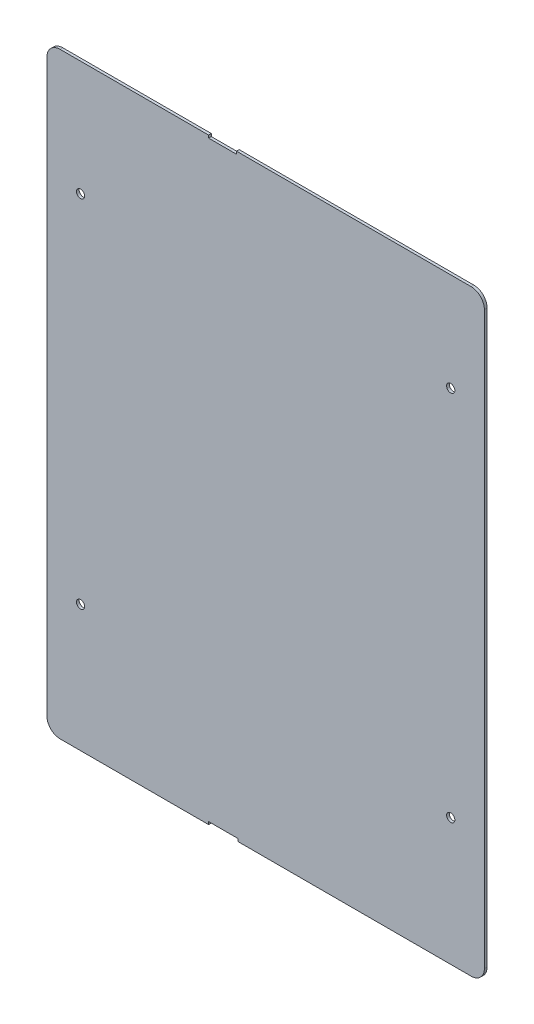
ISO-10303-21;
HEADER;
FILE_DESCRIPTION(('STEP AP214'),'2;1');
FILE_NAME('part.step','',(''),(''),'','','');
FILE_SCHEMA(('AUTOMOTIVE_DESIGN { 1 0 10303 214 1 1 1 1 }'));
ENDSEC;
DATA;
#1=APPLICATION_CONTEXT('core data for automotive mechanical design processes');
#2=APPLICATION_PROTOCOL_DEFINITION('international standard','automotive_design',2000,#1);
#3=PRODUCT_CONTEXT('',#1,'mechanical');
#4=PRODUCT('Part','Part','',(#3));
#5=PRODUCT_RELATED_PRODUCT_CATEGORY('part','',(#4));
#6=PRODUCT_DEFINITION_FORMATION('','',#4);
#7=PRODUCT_DEFINITION_CONTEXT('part definition',#1,'design');
#8=PRODUCT_DEFINITION('design','',#6,#7);
#9=PRODUCT_DEFINITION_SHAPE('','',#8);
#10=(LENGTH_UNIT() NAMED_UNIT(*) SI_UNIT(.MILLI.,.METRE.));
#11=(NAMED_UNIT(*) PLANE_ANGLE_UNIT() SI_UNIT($,.RADIAN.));
#12=(NAMED_UNIT(*) SI_UNIT($,.STERADIAN.) SOLID_ANGLE_UNIT());
#13=UNCERTAINTY_MEASURE_WITH_UNIT(LENGTH_MEASURE(1.E-05),#10,'distance_accuracy_value','');
#14=(GEOMETRIC_REPRESENTATION_CONTEXT(3) GLOBAL_UNCERTAINTY_ASSIGNED_CONTEXT((#13)) GLOBAL_UNIT_ASSIGNED_CONTEXT((#10,
#11,#12)) REPRESENTATION_CONTEXT('',''));
#15=CARTESIAN_POINT('',(0.,0.,0.));
#16=DIRECTION('',(0.,0.,1.));
#17=DIRECTION('',(1.,0.,0.));
#18=AXIS2_PLACEMENT_3D('',#15,#16,#17);
#19=CARTESIAN_POINT('',(-21.0000000000001,-225.24,2.032));
#20=DIRECTION('',(0.,1.,0.));
#21=DIRECTION('',(0.,0.,1.));
#22=AXIS2_PLACEMENT_3D('',#19,#20,#21);
#23=PLANE('',#22);
#24=DIRECTION('',(1.,0.,0.));
#25=VECTOR('',#24,1.);
#26=CARTESIAN_POINT('',(-21.0000000000001,-225.24,0.));
#27=LINE('',#26,#25);
#28=CARTESIAN_POINT('',(-21.0000000000001,-225.24,0.));
#29=VERTEX_POINT('',#28);
#30=CARTESIAN_POINT('',(155.,-225.24,0.));
#31=VERTEX_POINT('',#30);
#32=EDGE_CURVE('E199',#29,#31,#27,.T.);
#33=ORIENTED_EDGE('',*,*,#32,.T.);
#34=DIRECTION('',(0.,0.,-1.));
#35=VECTOR('',#34,1.);
#36=CARTESIAN_POINT('',(155.,-225.24,2.032));
#37=LINE('',#36,#35);
#38=CARTESIAN_POINT('',(155.,-225.24,2.032));
#39=VERTEX_POINT('',#38);
#40=EDGE_CURVE('E257',#31,#39,#37,.F.);
#41=ORIENTED_EDGE('',*,*,#40,.T.);
#42=DIRECTION('',(1.,0.,0.));
#43=VECTOR('',#42,1.);
#44=CARTESIAN_POINT('',(-21.0000000000001,-225.24,2.032));
#45=LINE('',#44,#43);
#46=CARTESIAN_POINT('',(-21.0000000000001,-225.24,2.032));
#47=VERTEX_POINT('',#46);
#48=EDGE_CURVE('E226',#47,#39,#45,.T.);
#49=ORIENTED_EDGE('',*,*,#48,.F.);
#50=DIRECTION('',(0.,0.,-1.));
#51=VECTOR('',#50,1.);
#52=CARTESIAN_POINT('',(-21.0000000000001,-225.24,2.032));
#53=LINE('',#52,#51);
#54=EDGE_CURVE('E198',#47,#29,#53,.T.);
#55=ORIENTED_EDGE('',*,*,#54,.T.);
#56=EDGE_LOOP('',(#33,#41,#49,#55));
#57=FACE_BOUND('',#56,.T.);
#58=ADVANCED_FACE('F39',(#57),#23,.F.);
#59=CARTESIAN_POINT('',(165.,225.24,2.032));
#60=DIRECTION('',(-1.,0.,0.));
#61=DIRECTION('',(0.,-1.,0.));
#62=AXIS2_PLACEMENT_3D('',#59,#60,#61);
#63=PLANE('',#62);
#64=DIRECTION('',(0.,1.,0.));
#65=VECTOR('',#64,1.);
#66=CARTESIAN_POINT('',(165.,225.24,2.032));
#67=LINE('',#66,#65);
#68=CARTESIAN_POINT('',(165.,-215.24,2.032));
#69=VERTEX_POINT('',#68);
#70=CARTESIAN_POINT('',(165.,215.24,2.032));
#71=VERTEX_POINT('',#70);
#72=EDGE_CURVE('E163',#69,#71,#67,.T.);
#73=ORIENTED_EDGE('',*,*,#72,.F.);
#74=DIRECTION('',(0.,0.,-1.));
#75=VECTOR('',#74,1.);
#76=CARTESIAN_POINT('',(165.,-215.24,2.032));
#77=LINE('',#76,#75);
#78=CARTESIAN_POINT('',(165.,-215.24,0.));
#79=VERTEX_POINT('',#78);
#80=EDGE_CURVE('E246',#69,#79,#77,.T.);
#81=ORIENTED_EDGE('',*,*,#80,.T.);
#82=DIRECTION('',(0.,1.,0.));
#83=VECTOR('',#82,1.);
#84=CARTESIAN_POINT('',(165.,225.24,0.));
#85=LINE('',#84,#83);
#86=CARTESIAN_POINT('',(165.,215.24,0.));
#87=VERTEX_POINT('',#86);
#88=EDGE_CURVE('E202',#79,#87,#85,.T.);
#89=ORIENTED_EDGE('',*,*,#88,.T.);
#90=DIRECTION('',(0.,0.,-1.));
#91=VECTOR('',#90,1.);
#92=CARTESIAN_POINT('',(165.,215.24,2.032));
#93=LINE('',#92,#91);
#94=EDGE_CURVE('E172',#87,#71,#93,.F.);
#95=ORIENTED_EDGE('',*,*,#94,.T.);
#96=EDGE_LOOP('',(#73,#81,#89,#95));
#97=FACE_BOUND('',#96,.T.);
#98=ADVANCED_FACE('F313',(#97),#63,.F.);
#99=CARTESIAN_POINT('',(-22.0000000000001,225.24,2.032));
#100=DIRECTION('',(0.,-1.,0.));
#101=DIRECTION('',(0.,0.,-1.));
#102=AXIS2_PLACEMENT_3D('',#99,#100,#101);
#103=PLANE('',#102);
#104=DIRECTION('',(-1.,0.,0.));
#105=VECTOR('',#104,1.);
#106=CARTESIAN_POINT('',(-22.0000000000001,225.24,2.032));
#107=LINE('',#106,#105);
#108=CARTESIAN_POINT('',(155.,225.24,2.032));
#109=VERTEX_POINT('',#108);
#110=CARTESIAN_POINT('',(-22.0000000000001,225.24,2.032));
#111=VERTEX_POINT('',#110);
#112=EDGE_CURVE('E150',#109,#111,#107,.T.);
#113=ORIENTED_EDGE('',*,*,#112,.F.);
#114=DIRECTION('',(0.,0.,-1.));
#115=VECTOR('',#114,1.);
#116=CARTESIAN_POINT('',(155.,225.24,2.032));
#117=LINE('',#116,#115);
#118=CARTESIAN_POINT('',(155.,225.24,0.));
#119=VERTEX_POINT('',#118);
#120=EDGE_CURVE('E265',#109,#119,#117,.T.);
#121=ORIENTED_EDGE('',*,*,#120,.T.);
#122=DIRECTION('',(-1.,0.,0.));
#123=VECTOR('',#122,1.);
#124=CARTESIAN_POINT('',(-22.0000000000001,225.24,0.));
#125=LINE('',#124,#123);
#126=CARTESIAN_POINT('',(-22.0000000000001,225.24,0.));
#127=VERTEX_POINT('',#126);
#128=EDGE_CURVE('E169',#119,#127,#125,.T.);
#129=ORIENTED_EDGE('',*,*,#128,.T.);
#130=DIRECTION('',(0.,0.,-1.));
#131=VECTOR('',#130,1.);
#132=CARTESIAN_POINT('',(-22.0000000000001,225.24,2.032));
#133=LINE('',#132,#131);
#134=EDGE_CURVE('E166',#111,#127,#133,.T.);
#135=ORIENTED_EDGE('',*,*,#134,.F.);
#136=EDGE_LOOP('',(#113,#121,#129,#135));
#137=FACE_BOUND('',#136,.T.);
#138=ADVANCED_FACE('F167',(#137),#103,.F.);
#139=CARTESIAN_POINT('',(-22.0000000000001,223.24,2.032));
#140=DIRECTION('',(1.,0.,0.));
#141=DIRECTION('',(0.,0.,-1.));
#142=AXIS2_PLACEMENT_3D('',#139,#140,#141);
#143=PLANE('',#142);
#144=DIRECTION('',(0.,-1.,0.));
#145=VECTOR('',#144,1.);
#146=CARTESIAN_POINT('',(-22.0000000000001,223.24,0.));
#147=LINE('',#146,#145);
#148=CARTESIAN_POINT('',(-22.0000000000001,223.24,0.));
#149=VERTEX_POINT('',#148);
#150=EDGE_CURVE('E207',#127,#149,#147,.T.);
#151=ORIENTED_EDGE('',*,*,#150,.T.);
#152=DIRECTION('',(0.,0.,-1.));
#153=VECTOR('',#152,1.);
#154=CARTESIAN_POINT('',(-22.0000000000001,223.24,2.032));
#155=LINE('',#154,#153);
#156=CARTESIAN_POINT('',(-22.0000000000001,223.24,2.032));
#157=VERTEX_POINT('',#156);
#158=EDGE_CURVE('E173',#157,#149,#155,.T.);
#159=ORIENTED_EDGE('',*,*,#158,.F.);
#160=DIRECTION('',(0.,-1.,0.));
#161=VECTOR('',#160,1.);
#162=CARTESIAN_POINT('',(-22.0000000000001,223.24,2.032));
#163=LINE('',#162,#161);
#164=EDGE_CURVE('E155',#111,#157,#163,.T.);
#165=ORIENTED_EDGE('',*,*,#164,.F.);
#166=ORIENTED_EDGE('',*,*,#134,.T.);
#167=EDGE_LOOP('',(#151,#159,#165,#166));
#168=FACE_BOUND('',#167,.T.);
#169=ADVANCED_FACE('F175',(#168),#143,.F.);
#170=CARTESIAN_POINT('',(-43.0000000000001,223.24,2.032));
#171=DIRECTION('',(0.,-1.,0.));
#172=DIRECTION('',(0.,0.,-1.));
#173=AXIS2_PLACEMENT_3D('',#170,#171,#172);
#174=PLANE('',#173);
#175=DIRECTION('',(-1.,0.,0.));
#176=VECTOR('',#175,1.);
#177=CARTESIAN_POINT('',(-43.0000000000001,223.24,0.));
#178=LINE('',#177,#176);
#179=CARTESIAN_POINT('',(-43.0000000000001,223.24,0.));
#180=VERTEX_POINT('',#179);
#181=EDGE_CURVE('E209',#149,#180,#178,.T.);
#182=ORIENTED_EDGE('',*,*,#181,.T.);
#183=DIRECTION('',(0.,0.,-1.));
#184=VECTOR('',#183,1.);
#185=CARTESIAN_POINT('',(-43.0000000000001,223.24,2.032));
#186=LINE('',#185,#184);
#187=CARTESIAN_POINT('',(-43.0000000000001,223.24,2.032));
#188=VERTEX_POINT('',#187);
#189=EDGE_CURVE('E241',#188,#180,#186,.T.);
#190=ORIENTED_EDGE('',*,*,#189,.F.);
#191=DIRECTION('',(-1.,0.,0.));
#192=VECTOR('',#191,1.);
#193=CARTESIAN_POINT('',(-43.0000000000001,223.24,2.032));
#194=LINE('',#193,#192);
#195=EDGE_CURVE('E178',#157,#188,#194,.T.);
#196=ORIENTED_EDGE('',*,*,#195,.F.);
#197=ORIENTED_EDGE('',*,*,#158,.T.);
#198=EDGE_LOOP('',(#182,#190,#196,#197));
#199=FACE_BOUND('',#198,.T.);
#200=ADVANCED_FACE('F401',(#199),#174,.F.);
#201=CARTESIAN_POINT('',(-43.0000000000001,225.24,2.032));
#202=DIRECTION('',(-1.,0.,0.));
#203=DIRECTION('',(0.,0.,1.));
#204=AXIS2_PLACEMENT_3D('',#201,#202,#203);
#205=PLANE('',#204);
#206=DIRECTION('',(0.,1.,0.));
#207=VECTOR('',#206,1.);
#208=CARTESIAN_POINT('',(-43.0000000000001,225.24,0.));
#209=LINE('',#208,#207);
#210=CARTESIAN_POINT('',(-43.0000000000001,225.24,0.));
#211=VERTEX_POINT('',#210);
#212=EDGE_CURVE('E211',#180,#211,#209,.T.);
#213=ORIENTED_EDGE('',*,*,#212,.T.);
#214=DIRECTION('',(0.,0.,-1.));
#215=VECTOR('',#214,1.);
#216=CARTESIAN_POINT('',(-43.0000000000001,225.24,2.032));
#217=LINE('',#216,#215);
#218=CARTESIAN_POINT('',(-43.0000000000001,225.24,2.032));
#219=VERTEX_POINT('',#218);
#220=EDGE_CURVE('E238',#219,#211,#217,.T.);
#221=ORIENTED_EDGE('',*,*,#220,.F.);
#222=DIRECTION('',(0.,1.,0.));
#223=VECTOR('',#222,1.);
#224=CARTESIAN_POINT('',(-43.0000000000001,225.24,2.032));
#225=LINE('',#224,#223);
#226=EDGE_CURVE('E180',#188,#219,#225,.T.);
#227=ORIENTED_EDGE('',*,*,#226,.F.);
#228=ORIENTED_EDGE('',*,*,#189,.T.);
#229=EDGE_LOOP('',(#213,#221,#227,#228));
#230=FACE_BOUND('',#229,.T.);
#231=ADVANCED_FACE('F398',(#230),#205,.F.);
#232=CARTESIAN_POINT('',(-165.,225.24,2.032));
#233=DIRECTION('',(0.,-1.,0.));
#234=DIRECTION('',(0.,0.,-1.));
#235=AXIS2_PLACEMENT_3D('',#232,#233,#234);
#236=PLANE('',#235);
#237=DIRECTION('',(-1.,0.,0.));
#238=VECTOR('',#237,1.);
#239=CARTESIAN_POINT('',(-165.,225.24,0.));
#240=LINE('',#239,#238);
#241=CARTESIAN_POINT('',(-155.,225.24,0.));
#242=VERTEX_POINT('',#241);
#243=EDGE_CURVE('E213',#211,#242,#240,.T.);
#244=ORIENTED_EDGE('',*,*,#243,.T.);
#245=DIRECTION('',(0.,0.,-1.));
#246=VECTOR('',#245,1.);
#247=CARTESIAN_POINT('',(-155.,225.24,2.032));
#248=LINE('',#247,#246);
#249=CARTESIAN_POINT('',(-155.,225.24,2.032));
#250=VERTEX_POINT('',#249);
#251=EDGE_CURVE('E11',#242,#250,#248,.F.);
#252=ORIENTED_EDGE('',*,*,#251,.T.);
#253=DIRECTION('',(-1.,0.,0.));
#254=VECTOR('',#253,1.);
#255=CARTESIAN_POINT('',(-165.,225.24,2.032));
#256=LINE('',#255,#254);
#257=EDGE_CURVE('E185',#219,#250,#256,.T.);
#258=ORIENTED_EDGE('',*,*,#257,.F.);
#259=ORIENTED_EDGE('',*,*,#220,.T.);
#260=EDGE_LOOP('',(#244,#252,#258,#259));
#261=FACE_BOUND('',#260,.T.);
#262=ADVANCED_FACE('F394',(#261),#236,.F.);
#263=CARTESIAN_POINT('',(-165.,225.24,2.032));
#264=DIRECTION('',(1.,0.,0.));
#265=DIRECTION('',(0.,1.,0.));
#266=AXIS2_PLACEMENT_3D('',#263,#264,#265);
#267=PLANE('',#266);
#268=DIRECTION('',(0.,-1.,0.));
#269=VECTOR('',#268,1.);
#270=CARTESIAN_POINT('',(-165.,225.24,0.));
#271=LINE('',#270,#269);
#272=CARTESIAN_POINT('',(-165.,215.24,0.));
#273=VERTEX_POINT('',#272);
#274=CARTESIAN_POINT('',(-165.,-215.24,0.));
#275=VERTEX_POINT('',#274);
#276=EDGE_CURVE('E216',#273,#275,#271,.T.);
#277=ORIENTED_EDGE('',*,*,#276,.T.);
#278=DIRECTION('',(0.,0.,-1.));
#279=VECTOR('',#278,1.);
#280=CARTESIAN_POINT('',(-165.,-215.24,2.032));
#281=LINE('',#280,#279);
#282=CARTESIAN_POINT('',(-165.,-215.24,2.032));
#283=VERTEX_POINT('',#282);
#284=EDGE_CURVE('E47',#275,#283,#281,.F.);
#285=ORIENTED_EDGE('',*,*,#284,.T.);
#286=DIRECTION('',(0.,-1.,0.));
#287=VECTOR('',#286,1.);
#288=CARTESIAN_POINT('',(-165.,225.24,2.032));
#289=LINE('',#288,#287);
#290=CARTESIAN_POINT('',(-165.,215.24,2.032));
#291=VERTEX_POINT('',#290);
#292=EDGE_CURVE('E188',#291,#283,#289,.T.);
#293=ORIENTED_EDGE('',*,*,#292,.F.);
#294=DIRECTION('',(0.,0.,-1.));
#295=VECTOR('',#294,1.);
#296=CARTESIAN_POINT('',(-165.,215.24,2.032));
#297=LINE('',#296,#295);
#298=EDGE_CURVE('E270',#291,#273,#297,.T.);
#299=ORIENTED_EDGE('',*,*,#298,.T.);
#300=EDGE_LOOP('',(#277,#285,#293,#299));
#301=FACE_BOUND('',#300,.T.);
#302=ADVANCED_FACE('F274',(#301),#267,.F.);
#303=CARTESIAN_POINT('',(-165.,-225.24,2.032));
#304=DIRECTION('',(0.,1.,0.));
#305=DIRECTION('',(0.,0.,1.));
#306=AXIS2_PLACEMENT_3D('',#303,#304,#305);
#307=PLANE('',#306);
#308=DIRECTION('',(1.,0.,0.));
#309=VECTOR('',#308,1.);
#310=CARTESIAN_POINT('',(-165.,-225.24,2.032));
#311=LINE('',#310,#309);
#312=CARTESIAN_POINT('',(-155.,-225.24,2.032));
#313=VERTEX_POINT('',#312);
#314=CARTESIAN_POINT('',(-43.,-225.24,2.032));
#315=VERTEX_POINT('',#314);
#316=EDGE_CURVE('E190',#313,#315,#311,.T.);
#317=ORIENTED_EDGE('',*,*,#316,.F.);
#318=DIRECTION('',(0.,0.,-1.));
#319=VECTOR('',#318,1.);
#320=CARTESIAN_POINT('',(-155.,-225.24,2.032));
#321=LINE('',#320,#319);
#322=CARTESIAN_POINT('',(-155.,-225.24,0.));
#323=VERTEX_POINT('',#322);
#324=EDGE_CURVE('E267',#313,#323,#321,.T.);
#325=ORIENTED_EDGE('',*,*,#324,.T.);
#326=DIRECTION('',(1.,0.,0.));
#327=VECTOR('',#326,1.);
#328=CARTESIAN_POINT('',(-165.,-225.24,0.));
#329=LINE('',#328,#327);
#330=CARTESIAN_POINT('',(-43.,-225.24,0.));
#331=VERTEX_POINT('',#330);
#332=EDGE_CURVE('E218',#323,#331,#329,.T.);
#333=ORIENTED_EDGE('',*,*,#332,.T.);
#334=DIRECTION('',(0.,0.,-1.));
#335=VECTOR('',#334,1.);
#336=CARTESIAN_POINT('',(-43.,-225.24,2.032));
#337=LINE('',#336,#335);
#338=EDGE_CURVE('E235',#315,#331,#337,.T.);
#339=ORIENTED_EDGE('',*,*,#338,.F.);
#340=EDGE_LOOP('',(#317,#325,#333,#339));
#341=FACE_BOUND('',#340,.T.);
#342=ADVANCED_FACE('F287',(#341),#307,.F.);
#343=CARTESIAN_POINT('',(-43.,-223.24,2.032));
#344=DIRECTION('',(-1.,0.,0.));
#345=DIRECTION('',(0.,0.,1.));
#346=AXIS2_PLACEMENT_3D('',#343,#344,#345);
#347=PLANE('',#346);
#348=DIRECTION('',(0.,1.,0.));
#349=VECTOR('',#348,1.);
#350=CARTESIAN_POINT('',(-43.,-223.24,0.));
#351=LINE('',#350,#349);
#352=CARTESIAN_POINT('',(-43.,-223.24,0.));
#353=VERTEX_POINT('',#352);
#354=EDGE_CURVE('E220',#331,#353,#351,.T.);
#355=ORIENTED_EDGE('',*,*,#354,.T.);
#356=DIRECTION('',(0.,0.,-1.));
#357=VECTOR('',#356,1.);
#358=CARTESIAN_POINT('',(-43.,-223.24,2.032));
#359=LINE('',#358,#357);
#360=CARTESIAN_POINT('',(-43.,-223.24,2.032));
#361=VERTEX_POINT('',#360);
#362=EDGE_CURVE('E232',#361,#353,#359,.T.);
#363=ORIENTED_EDGE('',*,*,#362,.F.);
#364=DIRECTION('',(0.,1.,0.));
#365=VECTOR('',#364,1.);
#366=CARTESIAN_POINT('',(-43.,-223.24,2.032));
#367=LINE('',#366,#365);
#368=EDGE_CURVE('E192',#315,#361,#367,.T.);
#369=ORIENTED_EDGE('',*,*,#368,.F.);
#370=ORIENTED_EDGE('',*,*,#338,.T.);
#371=EDGE_LOOP('',(#355,#363,#369,#370));
#372=FACE_BOUND('',#371,.T.);
#373=ADVANCED_FACE('F294',(#372),#347,.F.);
#374=CARTESIAN_POINT('',(-21.0000000000001,-223.24,2.032));
#375=DIRECTION('',(0.,1.,0.));
#376=DIRECTION('',(0.,0.,1.));
#377=AXIS2_PLACEMENT_3D('',#374,#375,#376);
#378=PLANE('',#377);
#379=DIRECTION('',(1.,0.,0.));
#380=VECTOR('',#379,1.);
#381=CARTESIAN_POINT('',(-21.0000000000001,-223.24,0.));
#382=LINE('',#381,#380);
#383=CARTESIAN_POINT('',(-21.0000000000001,-223.24,0.));
#384=VERTEX_POINT('',#383);
#385=EDGE_CURVE('E222',#353,#384,#382,.T.);
#386=ORIENTED_EDGE('',*,*,#385,.T.);
#387=DIRECTION('',(0.,0.,-1.));
#388=VECTOR('',#387,1.);
#389=CARTESIAN_POINT('',(-21.0000000000001,-223.24,2.032));
#390=LINE('',#389,#388);
#391=CARTESIAN_POINT('',(-21.0000000000001,-223.24,2.032));
#392=VERTEX_POINT('',#391);
#393=EDGE_CURVE('E229',#392,#384,#390,.T.);
#394=ORIENTED_EDGE('',*,*,#393,.F.);
#395=DIRECTION('',(1.,0.,0.));
#396=VECTOR('',#395,1.);
#397=CARTESIAN_POINT('',(-21.0000000000001,-223.24,2.032));
#398=LINE('',#397,#396);
#399=EDGE_CURVE('E194',#361,#392,#398,.T.);
#400=ORIENTED_EDGE('',*,*,#399,.F.);
#401=ORIENTED_EDGE('',*,*,#362,.T.);
#402=EDGE_LOOP('',(#386,#394,#400,#401));
#403=FACE_BOUND('',#402,.T.);
#404=ADVANCED_FACE('F297',(#403),#378,.F.);
#405=CARTESIAN_POINT('',(-21.0000000000001,-225.24,2.032));
#406=DIRECTION('',(1.,0.,0.));
#407=DIRECTION('',(0.,0.,-1.));
#408=AXIS2_PLACEMENT_3D('',#405,#406,#407);
#409=PLANE('',#408);
#410=DIRECTION('',(0.,-1.,0.));
#411=VECTOR('',#410,1.);
#412=CARTESIAN_POINT('',(-21.0000000000001,-225.24,0.));
#413=LINE('',#412,#411);
#414=EDGE_CURVE('E224',#384,#29,#413,.T.);
#415=ORIENTED_EDGE('',*,*,#414,.T.);
#416=ORIENTED_EDGE('',*,*,#54,.F.);
#417=DIRECTION('',(0.,-1.,0.));
#418=VECTOR('',#417,1.);
#419=CARTESIAN_POINT('',(-21.0000000000001,-225.24,2.032));
#420=LINE('',#419,#418);
#421=EDGE_CURVE('E196',#392,#47,#420,.T.);
#422=ORIENTED_EDGE('',*,*,#421,.F.);
#423=ORIENTED_EDGE('',*,*,#393,.T.);
#424=EDGE_LOOP('',(#415,#416,#422,#423));
#425=FACE_BOUND('',#424,.T.);
#426=ADVANCED_FACE('F302',(#425),#409,.F.);
#427=CARTESIAN_POINT('',(0.,0.,2.032));
#428=DIRECTION('',(0.,0.,-1.));
#429=DIRECTION('',(-1.,0.,0.));
#430=AXIS2_PLACEMENT_3D('',#427,#428,#429);
#431=PLANE('',#430);
#432=CARTESIAN_POINT('',(139.6000030558,-129.360049888892,2.032));
#433=DIRECTION('',(0.,0.,-1.));
#434=DIRECTION('',(-1.,0.,0.));
#435=AXIS2_PLACEMENT_3D('',#432,#433,#434);
#436=CIRCLE('',#435,3.09999999999999);
#437=CARTESIAN_POINT('',(136.5000030558,-129.360049888892,2.032));
#438=VERTEX_POINT('',#437);
#439=EDGE_CURVE('E203',#438,#438,#436,.T.);
#440=ORIENTED_EDGE('',*,*,#439,.T.);
#441=EDGE_LOOP('',(#440));
#442=FACE_BOUND('',#441,.T.);
#443=CARTESIAN_POINT('',(139.600003055801,151.1660051673,2.032));
#444=DIRECTION('',(0.,0.,-1.));
#445=DIRECTION('',(-1.,0.,0.));
#446=AXIS2_PLACEMENT_3D('',#443,#444,#445);
#447=CIRCLE('',#446,3.09999999999999);
#448=CARTESIAN_POINT('',(136.500003055801,151.1660051673,2.032));
#449=VERTEX_POINT('',#448);
#450=EDGE_CURVE('E321',#449,#449,#447,.T.);
#451=ORIENTED_EDGE('',*,*,#450,.T.);
#452=EDGE_LOOP('',(#451));
#453=FACE_BOUND('',#452,.T.);
#454=CARTESIAN_POINT('',(-139.599996944201,138.555201516818,2.032));
#455=DIRECTION('',(0.,0.,-1.));
#456=DIRECTION('',(-1.,0.,0.));
#457=AXIS2_PLACEMENT_3D('',#454,#455,#456);
#458=CIRCLE('',#457,3.09999999999999);
#459=CARTESIAN_POINT('',(-142.699996944201,138.555201516818,2.032));
#460=VERTEX_POINT('',#459);
#461=EDGE_CURVE('E324',#460,#460,#458,.T.);
#462=ORIENTED_EDGE('',*,*,#461,.T.);
#463=EDGE_LOOP('',(#462));
#464=FACE_BOUND('',#463,.T.);
#465=CARTESIAN_POINT('',(-139.599996944201,-129.61479672001,2.032));
#466=DIRECTION('',(0.,0.,-1.));
#467=DIRECTION('',(-1.,0.,0.));
#468=AXIS2_PLACEMENT_3D('',#465,#466,#467);
#469=CIRCLE('',#468,3.09999999999999);
#470=CARTESIAN_POINT('',(-142.699996944201,-129.61479672001,2.032));
#471=VERTEX_POINT('',#470);
#472=EDGE_CURVE('E327',#471,#471,#469,.T.);
#473=ORIENTED_EDGE('',*,*,#472,.T.);
#474=EDGE_LOOP('',(#473));
#475=FACE_BOUND('',#474,.T.);
#476=ORIENTED_EDGE('',*,*,#48,.T.);
#477=CARTESIAN_POINT('',(155.,-215.24,2.032));
#478=DIRECTION('',(0.,0.,-1.));
#479=DIRECTION('',(-1.,0.,0.));
#480=AXIS2_PLACEMENT_3D('',#477,#478,#479);
#481=CIRCLE('',#480,10.);
#482=EDGE_CURVE('E263',#39,#69,#481,.F.);
#483=ORIENTED_EDGE('',*,*,#482,.T.);
#484=ORIENTED_EDGE('',*,*,#72,.T.);
#485=CARTESIAN_POINT('',(155.,215.24,2.032));
#486=DIRECTION('',(0.,0.,-1.));
#487=DIRECTION('',(-1.,0.,0.));
#488=AXIS2_PLACEMENT_3D('',#485,#486,#487);
#489=CIRCLE('',#488,10.);
#490=EDGE_CURVE('E159',#71,#109,#489,.F.);
#491=ORIENTED_EDGE('',*,*,#490,.T.);
#492=ORIENTED_EDGE('',*,*,#112,.T.);
#493=ORIENTED_EDGE('',*,*,#164,.T.);
#494=ORIENTED_EDGE('',*,*,#195,.T.);
#495=ORIENTED_EDGE('',*,*,#226,.T.);
#496=ORIENTED_EDGE('',*,*,#257,.T.);
#497=CARTESIAN_POINT('',(-155.,215.24,2.032));
#498=DIRECTION('',(0.,0.,-1.));
#499=DIRECTION('',(-1.,0.,0.));
#500=AXIS2_PLACEMENT_3D('',#497,#498,#499);
#501=CIRCLE('',#500,10.);
#502=EDGE_CURVE('E259',#250,#291,#501,.F.);
#503=ORIENTED_EDGE('',*,*,#502,.T.);
#504=ORIENTED_EDGE('',*,*,#292,.T.);
#505=CARTESIAN_POINT('',(-155.,-215.24,2.032));
#506=DIRECTION('',(0.,0.,-1.));
#507=DIRECTION('',(-1.,0.,0.));
#508=AXIS2_PLACEMENT_3D('',#505,#506,#507);
#509=CIRCLE('',#508,10.);
#510=EDGE_CURVE('E54',#283,#313,#509,.F.);
#511=ORIENTED_EDGE('',*,*,#510,.T.);
#512=ORIENTED_EDGE('',*,*,#316,.T.);
#513=ORIENTED_EDGE('',*,*,#368,.T.);
#514=ORIENTED_EDGE('',*,*,#399,.T.);
#515=ORIENTED_EDGE('',*,*,#421,.T.);
#516=EDGE_LOOP('',(#476,#483,#484,#491,#492,#493,#494,#495,#496,#503,#504,#511,#512,#513,#514,#515));
#517=FACE_BOUND('',#516,.T.);
#518=ADVANCED_FACE('F153',(#442,#453,#464,#475,#517),#431,.F.);
#519=CARTESIAN_POINT('',(0.,0.,0.));
#520=DIRECTION('',(0.,0.,-1.));
#521=DIRECTION('',(-1.,0.,0.));
#522=AXIS2_PLACEMENT_3D('',#519,#520,#521);
#523=PLANE('',#522);
#524=CARTESIAN_POINT('',(139.6000030558,-129.360049888892,0.));
#525=DIRECTION('',(0.,0.,1.));
#526=DIRECTION('',(1.,0.,0.));
#527=AXIS2_PLACEMENT_3D('',#524,#525,#526);
#528=CIRCLE('',#527,3.09999999999999);
#529=CARTESIAN_POINT('',(142.7000030558,-129.360049888892,0.));
#530=VERTEX_POINT('',#529);
#531=EDGE_CURVE('E334',#530,#530,#528,.T.);
#532=ORIENTED_EDGE('',*,*,#531,.T.);
#533=EDGE_LOOP('',(#532));
#534=FACE_BOUND('',#533,.T.);
#535=CARTESIAN_POINT('',(139.600003055801,151.1660051673,0.));
#536=DIRECTION('',(0.,0.,1.));
#537=DIRECTION('',(1.,0.,0.));
#538=AXIS2_PLACEMENT_3D('',#535,#536,#537);
#539=CIRCLE('',#538,3.09999999999999);
#540=CARTESIAN_POINT('',(142.700003055801,151.1660051673,0.));
#541=VERTEX_POINT('',#540);
#542=EDGE_CURVE('E337',#541,#541,#539,.T.);
#543=ORIENTED_EDGE('',*,*,#542,.T.);
#544=EDGE_LOOP('',(#543));
#545=FACE_BOUND('',#544,.T.);
#546=CARTESIAN_POINT('',(-139.599996944201,138.555201516818,0.));
#547=DIRECTION('',(0.,0.,1.));
#548=DIRECTION('',(1.,0.,0.));
#549=AXIS2_PLACEMENT_3D('',#546,#547,#548);
#550=CIRCLE('',#549,3.09999999999999);
#551=CARTESIAN_POINT('',(-136.499996944201,138.555201516818,0.));
#552=VERTEX_POINT('',#551);
#553=EDGE_CURVE('E333',#552,#552,#550,.T.);
#554=ORIENTED_EDGE('',*,*,#553,.T.);
#555=EDGE_LOOP('',(#554));
#556=FACE_BOUND('',#555,.T.);
#557=CARTESIAN_POINT('',(-139.599996944201,-129.61479672001,0.));
#558=DIRECTION('',(0.,0.,1.));
#559=DIRECTION('',(1.,0.,0.));
#560=AXIS2_PLACEMENT_3D('',#557,#558,#559);
#561=CIRCLE('',#560,3.09999999999999);
#562=CARTESIAN_POINT('',(-136.499996944201,-129.61479672001,0.));
#563=VERTEX_POINT('',#562);
#564=EDGE_CURVE('E330',#563,#563,#561,.T.);
#565=ORIENTED_EDGE('',*,*,#564,.T.);
#566=EDGE_LOOP('',(#565));
#567=FACE_BOUND('',#566,.T.);
#568=ORIENTED_EDGE('',*,*,#88,.F.);
#569=CARTESIAN_POINT('',(155.,-215.24,0.));
#570=DIRECTION('',(0.,0.,-1.));
#571=DIRECTION('',(-1.,0.,0.));
#572=AXIS2_PLACEMENT_3D('',#569,#570,#571);
#573=CIRCLE('',#572,10.);
#574=EDGE_CURVE('E255',#79,#31,#573,.T.);
#575=ORIENTED_EDGE('',*,*,#574,.T.);
#576=ORIENTED_EDGE('',*,*,#32,.F.);
#577=ORIENTED_EDGE('',*,*,#414,.F.);
#578=ORIENTED_EDGE('',*,*,#385,.F.);
#579=ORIENTED_EDGE('',*,*,#354,.F.);
#580=ORIENTED_EDGE('',*,*,#332,.F.);
#581=CARTESIAN_POINT('',(-155.,-215.24,0.));
#582=DIRECTION('',(0.,0.,-1.));
#583=DIRECTION('',(-1.,0.,0.));
#584=AXIS2_PLACEMENT_3D('',#581,#582,#583);
#585=CIRCLE('',#584,10.);
#586=EDGE_CURVE('E251',#323,#275,#585,.T.);
#587=ORIENTED_EDGE('',*,*,#586,.T.);
#588=ORIENTED_EDGE('',*,*,#276,.F.);
#589=CARTESIAN_POINT('',(-155.,215.24,0.));
#590=DIRECTION('',(0.,0.,-1.));
#591=DIRECTION('',(-1.,0.,0.));
#592=AXIS2_PLACEMENT_3D('',#589,#590,#591);
#593=CIRCLE('',#592,10.);
#594=EDGE_CURVE('E249',#273,#242,#593,.T.);
#595=ORIENTED_EDGE('',*,*,#594,.T.);
#596=ORIENTED_EDGE('',*,*,#243,.F.);
#597=ORIENTED_EDGE('',*,*,#212,.F.);
#598=ORIENTED_EDGE('',*,*,#181,.F.);
#599=ORIENTED_EDGE('',*,*,#150,.F.);
#600=ORIENTED_EDGE('',*,*,#128,.F.);
#601=CARTESIAN_POINT('',(155.,215.24,0.));
#602=DIRECTION('',(0.,0.,-1.));
#603=DIRECTION('',(-1.,0.,0.));
#604=AXIS2_PLACEMENT_3D('',#601,#602,#603);
#605=CIRCLE('',#604,10.);
#606=EDGE_CURVE('E253',#119,#87,#605,.T.);
#607=ORIENTED_EDGE('',*,*,#606,.T.);
#608=EDGE_LOOP('',(#568,#575,#576,#577,#578,#579,#580,#587,#588,#595,#596,#597,#598,#599,#600,#607));
#609=FACE_BOUND('',#608,.T.);
#610=ADVANCED_FACE('F279',(#534,#545,#556,#567,#609),#523,.T.);
#611=CARTESIAN_POINT('',(-139.599996944201,-129.61479672001,0.));
#612=DIRECTION('',(0.,0.,1.));
#613=DIRECTION('',(1.,0.,0.));
#614=AXIS2_PLACEMENT_3D('',#611,#612,#613);
#615=CYLINDRICAL_SURFACE('',#614,3.09999999999999);
#616=ORIENTED_EDGE('',*,*,#564,.F.);
#617=EDGE_LOOP('',(#616));
#618=FACE_BOUND('',#617,.T.);
#619=ORIENTED_EDGE('',*,*,#472,.F.);
#620=EDGE_LOOP('',(#619));
#621=FACE_BOUND('',#620,.T.);
#622=ADVANCED_FACE('F349',(#618,#621),#615,.F.);
#623=CARTESIAN_POINT('',(-139.599996944201,138.555201516818,0.));
#624=DIRECTION('',(0.,0.,1.));
#625=DIRECTION('',(1.,0.,0.));
#626=AXIS2_PLACEMENT_3D('',#623,#624,#625);
#627=CYLINDRICAL_SURFACE('',#626,3.09999999999999);
#628=ORIENTED_EDGE('',*,*,#553,.F.);
#629=EDGE_LOOP('',(#628));
#630=FACE_BOUND('',#629,.T.);
#631=ORIENTED_EDGE('',*,*,#461,.F.);
#632=EDGE_LOOP('',(#631));
#633=FACE_BOUND('',#632,.T.);
#634=ADVANCED_FACE('F345',(#630,#633),#627,.F.);
#635=CARTESIAN_POINT('',(139.600003055801,151.1660051673,0.));
#636=DIRECTION('',(0.,0.,1.));
#637=DIRECTION('',(1.,0.,0.));
#638=AXIS2_PLACEMENT_3D('',#635,#636,#637);
#639=CYLINDRICAL_SURFACE('',#638,3.09999999999999);
#640=ORIENTED_EDGE('',*,*,#542,.F.);
#641=EDGE_LOOP('',(#640));
#642=FACE_BOUND('',#641,.T.);
#643=ORIENTED_EDGE('',*,*,#450,.F.);
#644=EDGE_LOOP('',(#643));
#645=FACE_BOUND('',#644,.T.);
#646=ADVANCED_FACE('F348',(#642,#645),#639,.F.);
#647=CARTESIAN_POINT('',(139.6000030558,-129.360049888892,0.));
#648=DIRECTION('',(0.,0.,1.));
#649=DIRECTION('',(1.,0.,0.));
#650=AXIS2_PLACEMENT_3D('',#647,#648,#649);
#651=CYLINDRICAL_SURFACE('',#650,3.09999999999999);
#652=ORIENTED_EDGE('',*,*,#531,.F.);
#653=EDGE_LOOP('',(#652));
#654=FACE_BOUND('',#653,.T.);
#655=ORIENTED_EDGE('',*,*,#439,.F.);
#656=EDGE_LOOP('',(#655));
#657=FACE_BOUND('',#656,.T.);
#658=ADVANCED_FACE('F381',(#654,#657),#651,.F.);
#659=CARTESIAN_POINT('',(155.,-215.24,2.032));
#660=DIRECTION('',(0.,0.,-1.));
#661=DIRECTION('',(-1.,0.,0.));
#662=AXIS2_PLACEMENT_3D('',#659,#660,#661);
#663=CYLINDRICAL_SURFACE('',#662,10.);
#664=ORIENTED_EDGE('',*,*,#482,.F.);
#665=ORIENTED_EDGE('',*,*,#40,.F.);
#666=ORIENTED_EDGE('',*,*,#574,.F.);
#667=ORIENTED_EDGE('',*,*,#80,.F.);
#668=EDGE_LOOP('',(#664,#665,#666,#667));
#669=FACE_BOUND('',#668,.T.);
#670=ADVANCED_FACE('F311',(#669),#663,.T.);
#671=CARTESIAN_POINT('',(155.,215.24,2.032));
#672=DIRECTION('',(0.,0.,-1.));
#673=DIRECTION('',(-1.,0.,0.));
#674=AXIS2_PLACEMENT_3D('',#671,#672,#673);
#675=CYLINDRICAL_SURFACE('',#674,10.);
#676=ORIENTED_EDGE('',*,*,#490,.F.);
#677=ORIENTED_EDGE('',*,*,#94,.F.);
#678=ORIENTED_EDGE('',*,*,#606,.F.);
#679=ORIENTED_EDGE('',*,*,#120,.F.);
#680=EDGE_LOOP('',(#676,#677,#678,#679));
#681=FACE_BOUND('',#680,.T.);
#682=ADVANCED_FACE('F317',(#681),#675,.T.);
#683=CARTESIAN_POINT('',(-155.,-215.24,2.032));
#684=DIRECTION('',(0.,0.,-1.));
#685=DIRECTION('',(-1.,0.,0.));
#686=AXIS2_PLACEMENT_3D('',#683,#684,#685);
#687=CYLINDRICAL_SURFACE('',#686,10.);
#688=ORIENTED_EDGE('',*,*,#510,.F.);
#689=ORIENTED_EDGE('',*,*,#284,.F.);
#690=ORIENTED_EDGE('',*,*,#586,.F.);
#691=ORIENTED_EDGE('',*,*,#324,.F.);
#692=EDGE_LOOP('',(#688,#689,#690,#691));
#693=FACE_BOUND('',#692,.T.);
#694=ADVANCED_FACE('F285',(#693),#687,.T.);
#695=CARTESIAN_POINT('',(-155.,215.24,2.032));
#696=DIRECTION('',(0.,0.,-1.));
#697=DIRECTION('',(-1.,0.,0.));
#698=AXIS2_PLACEMENT_3D('',#695,#696,#697);
#699=CYLINDRICAL_SURFACE('',#698,10.);
#700=ORIENTED_EDGE('',*,*,#502,.F.);
#701=ORIENTED_EDGE('',*,*,#251,.F.);
#702=ORIENTED_EDGE('',*,*,#594,.F.);
#703=ORIENTED_EDGE('',*,*,#298,.F.);
#704=EDGE_LOOP('',(#700,#701,#702,#703));
#705=FACE_BOUND('',#704,.T.);
#706=ADVANCED_FACE('F41',(#705),#699,.T.);
#707=CLOSED_SHELL('',(#58,#98,#138,#169,#200,#231,#262,#302,#342,#373,#404,#426,#518,#610,#622,
#634,#646,#658,#670,#682,#694,#706));
#708=MANIFOLD_SOLID_BREP('B2',#707);
#709=ADVANCED_BREP_SHAPE_REPRESENTATION('',(#18,#708),#14);
#710=SHAPE_DEFINITION_REPRESENTATION(#9,#709);
ENDSEC;
END-ISO-10303-21;
